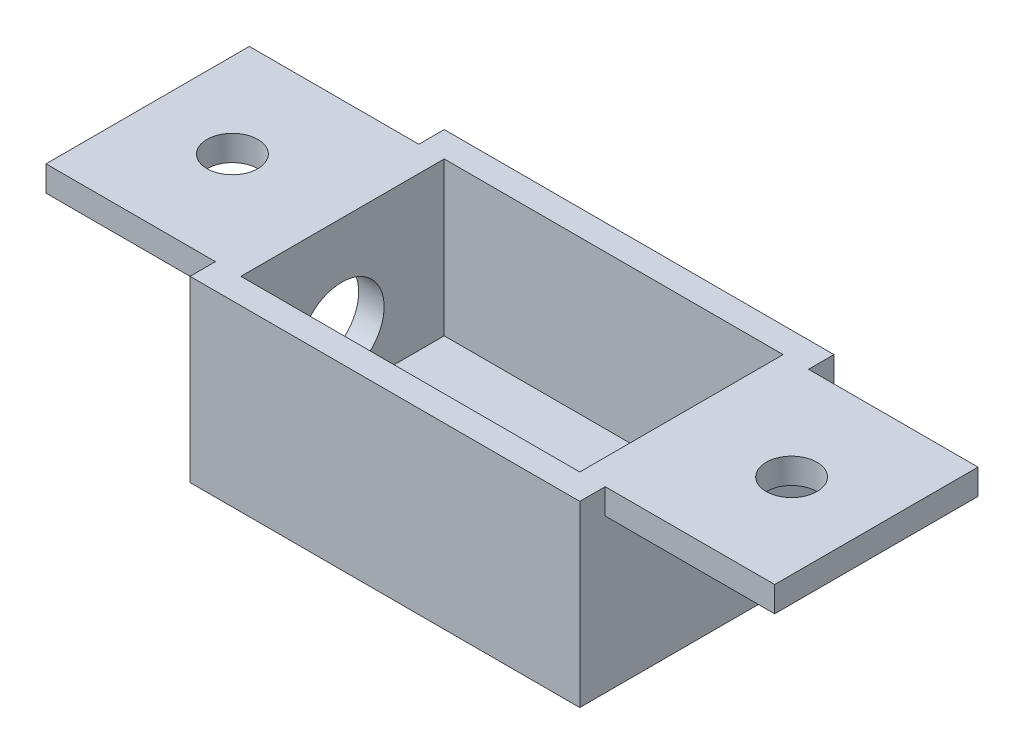
ISO-10303-21;
HEADER;
FILE_DESCRIPTION(('STEP AP214'),'2;1');
FILE_NAME('part.step','',(''),(''),'','','');
FILE_SCHEMA(('AUTOMOTIVE_DESIGN { 1 0 10303 214 1 1 1 1 }'));
ENDSEC;
DATA;
#1=APPLICATION_CONTEXT('core data for automotive mechanical design processes');
#2=APPLICATION_PROTOCOL_DEFINITION('international standard','automotive_design',2000,#1);
#3=PRODUCT_CONTEXT('',#1,'mechanical');
#4=PRODUCT('Part','Part','',(#3));
#5=PRODUCT_RELATED_PRODUCT_CATEGORY('part','',(#4));
#6=PRODUCT_DEFINITION_FORMATION('','',#4);
#7=PRODUCT_DEFINITION_CONTEXT('part definition',#1,'design');
#8=PRODUCT_DEFINITION('design','',#6,#7);
#9=PRODUCT_DEFINITION_SHAPE('','',#8);
#10=(LENGTH_UNIT() NAMED_UNIT(*) SI_UNIT(.MILLI.,.METRE.));
#11=(NAMED_UNIT(*) PLANE_ANGLE_UNIT() SI_UNIT($,.RADIAN.));
#12=(NAMED_UNIT(*) SI_UNIT($,.STERADIAN.) SOLID_ANGLE_UNIT());
#13=UNCERTAINTY_MEASURE_WITH_UNIT(LENGTH_MEASURE(1.E-05),#10,'distance_accuracy_value','');
#14=(GEOMETRIC_REPRESENTATION_CONTEXT(3) GLOBAL_UNCERTAINTY_ASSIGNED_CONTEXT((#13)) GLOBAL_UNIT_ASSIGNED_CONTEXT((#10,
#11,#12)) REPRESENTATION_CONTEXT('',''));
#15=CARTESIAN_POINT('',(0.,0.,0.));
#16=DIRECTION('',(0.,0.,1.));
#17=DIRECTION('',(1.,0.,0.));
#18=AXIS2_PLACEMENT_3D('',#15,#16,#17);
#19=CARTESIAN_POINT('',(0.,0.,0.));
#20=DIRECTION('',(0.,0.,1.));
#21=DIRECTION('',(1.,0.,0.));
#22=AXIS2_PLACEMENT_3D('',#19,#20,#21);
#23=PLANE('',#22);
#24=DIRECTION('',(0.,-1.,0.));
#25=VECTOR('',#24,1.);
#26=CARTESIAN_POINT('',(0.,7.81196010297524,0.));
#27=LINE('',#26,#25);
#28=CARTESIAN_POINT('',(0.,28.893533874708,0.));
#29=VERTEX_POINT('',#28);
#30=CARTESIAN_POINT('',(0.,25.893533874708,0.));
#31=VERTEX_POINT('',#30);
#32=EDGE_CURVE('E51',#29,#31,#27,.T.);
#33=ORIENTED_EDGE('',*,*,#32,.F.);
#34=DIRECTION('',(-1.,0.,0.));
#35=VECTOR('',#34,1.);
#36=CARTESIAN_POINT('',(-3.,28.893533874708,0.));
#37=LINE('',#36,#35);
#38=CARTESIAN_POINT('',(20.,28.893533874708,0.));
#39=VERTEX_POINT('',#38);
#40=EDGE_CURVE('E248',#39,#29,#37,.T.);
#41=ORIENTED_EDGE('',*,*,#40,.F.);
#42=DIRECTION('',(0.,1.,0.));
#43=VECTOR('',#42,1.);
#44=CARTESIAN_POINT('',(20.,25.893533874708,0.));
#45=LINE('',#44,#43);
#46=CARTESIAN_POINT('',(20.,25.893533874708,0.));
#47=VERTEX_POINT('',#46);
#48=EDGE_CURVE('E246',#47,#39,#45,.T.);
#49=ORIENTED_EDGE('',*,*,#48,.F.);
#50=DIRECTION('',(1.,0.,0.));
#51=VECTOR('',#50,1.);
#52=CARTESIAN_POINT('',(0.,25.893533874708,0.));
#53=LINE('',#52,#51);
#54=EDGE_CURVE('E244',#31,#47,#53,.T.);
#55=ORIENTED_EDGE('',*,*,#54,.F.);
#56=EDGE_LOOP('',(#33,#41,#49,#55));
#57=FACE_BOUND('',#56,.T.);
#58=ADVANCED_FACE('F34',(#57),#23,.F.);
#59=DIRECTION('',(0.,1.,0.));
#60=VECTOR('',#59,1.);
#61=CARTESIAN_POINT('',(-46.,7.81196010297524,0.));
#62=LINE('',#61,#60);
#63=CARTESIAN_POINT('',(-46.,25.893533874708,0.));
#64=VERTEX_POINT('',#63);
#65=CARTESIAN_POINT('',(-46.,28.893533874708,0.));
#66=VERTEX_POINT('',#65);
#67=EDGE_CURVE('E11',#64,#66,#62,.T.);
#68=ORIENTED_EDGE('',*,*,#67,.F.);
#69=DIRECTION('',(1.,0.,0.));
#70=VECTOR('',#69,1.);
#71=CARTESIAN_POINT('',(-66.,25.893533874708,0.));
#72=LINE('',#71,#70);
#73=CARTESIAN_POINT('',(-66.,25.893533874708,0.));
#74=VERTEX_POINT('',#73);
#75=EDGE_CURVE('E241',#74,#64,#72,.T.);
#76=ORIENTED_EDGE('',*,*,#75,.F.);
#77=DIRECTION('',(0.,-1.,0.));
#78=VECTOR('',#77,1.);
#79=CARTESIAN_POINT('',(-66.,28.893533874708,0.));
#80=LINE('',#79,#78);
#81=CARTESIAN_POINT('',(-66.,28.893533874708,0.));
#82=VERTEX_POINT('',#81);
#83=EDGE_CURVE('E214',#82,#74,#80,.T.);
#84=ORIENTED_EDGE('',*,*,#83,.F.);
#85=DIRECTION('',(-1.,0.,0.));
#86=VECTOR('',#85,1.);
#87=CARTESIAN_POINT('',(-66.,28.893533874708,0.));
#88=LINE('',#87,#86);
#89=EDGE_CURVE('E219',#66,#82,#88,.T.);
#90=ORIENTED_EDGE('',*,*,#89,.F.);
#91=EDGE_LOOP('',(#68,#76,#84,#90));
#92=FACE_BOUND('',#91,.T.);
#93=ADVANCED_FACE('F322',(#92),#23,.F.);
#94=CARTESIAN_POINT('',(0.,0.,24.));
#95=DIRECTION('',(0.,0.,1.));
#96=DIRECTION('',(1.,0.,0.));
#97=AXIS2_PLACEMENT_3D('',#94,#95,#96);
#98=PLANE('',#97);
#99=DIRECTION('',(0.,-1.,0.));
#100=VECTOR('',#99,1.);
#101=CARTESIAN_POINT('',(-46.,7.81196010297524,24.));
#102=LINE('',#101,#100);
#103=CARTESIAN_POINT('',(-46.,28.893533874708,24.));
#104=VERTEX_POINT('',#103);
#105=CARTESIAN_POINT('',(-46.,25.893533874708,24.));
#106=VERTEX_POINT('',#105);
#107=EDGE_CURVE('E59',#104,#106,#102,.T.);
#108=ORIENTED_EDGE('',*,*,#107,.F.);
#109=DIRECTION('',(-1.,0.,0.));
#110=VECTOR('',#109,1.);
#111=CARTESIAN_POINT('',(-66.,28.893533874708,24.));
#112=LINE('',#111,#110);
#113=CARTESIAN_POINT('',(-66.,28.893533874708,24.));
#114=VERTEX_POINT('',#113);
#115=EDGE_CURVE('E236',#104,#114,#112,.T.);
#116=ORIENTED_EDGE('',*,*,#115,.T.);
#117=DIRECTION('',(0.,-1.,0.));
#118=VECTOR('',#117,1.);
#119=CARTESIAN_POINT('',(-66.,28.893533874708,24.));
#120=LINE('',#119,#118);
#121=CARTESIAN_POINT('',(-66.,25.893533874708,24.));
#122=VERTEX_POINT('',#121);
#123=EDGE_CURVE('E215',#114,#122,#120,.T.);
#124=ORIENTED_EDGE('',*,*,#123,.T.);
#125=DIRECTION('',(1.,0.,0.));
#126=VECTOR('',#125,1.);
#127=CARTESIAN_POINT('',(-66.,25.893533874708,24.));
#128=LINE('',#127,#126);
#129=EDGE_CURVE('E218',#122,#106,#128,.T.);
#130=ORIENTED_EDGE('',*,*,#129,.T.);
#131=EDGE_LOOP('',(#108,#116,#124,#130));
#132=FACE_BOUND('',#131,.T.);
#133=ADVANCED_FACE('F320',(#132),#98,.T.);
#134=CARTESIAN_POINT('',(-66.,28.893533874708,24.));
#135=DIRECTION('',(1.,0.,0.));
#136=DIRECTION('',(0.,0.,-1.));
#137=AXIS2_PLACEMENT_3D('',#134,#135,#136);
#138=PLANE('',#137);
#139=ORIENTED_EDGE('',*,*,#83,.T.);
#140=DIRECTION('',(0.,0.,-1.));
#141=VECTOR('',#140,1.);
#142=CARTESIAN_POINT('',(-66.,25.893533874708,24.));
#143=LINE('',#142,#141);
#144=EDGE_CURVE('E206',#122,#74,#143,.T.);
#145=ORIENTED_EDGE('',*,*,#144,.F.);
#146=ORIENTED_EDGE('',*,*,#123,.F.);
#147=DIRECTION('',(0.,0.,-1.));
#148=VECTOR('',#147,1.);
#149=CARTESIAN_POINT('',(-66.,28.893533874708,24.));
#150=LINE('',#149,#148);
#151=EDGE_CURVE('E238',#114,#82,#150,.T.);
#152=ORIENTED_EDGE('',*,*,#151,.T.);
#153=EDGE_LOOP('',(#139,#145,#146,#152));
#154=FACE_BOUND('',#153,.T.);
#155=ADVANCED_FACE('F36',(#154),#138,.F.);
#156=CARTESIAN_POINT('',(-66.,25.893533874708,24.));
#157=DIRECTION('',(0.,1.,0.));
#158=DIRECTION('',(0.,0.,1.));
#159=AXIS2_PLACEMENT_3D('',#156,#157,#158);
#160=PLANE('',#159);
#161=CARTESIAN_POINT('',(-56.,25.893533874708,12.));
#162=DIRECTION('',(0.,-1.,0.));
#163=DIRECTION('',(1.,0.,0.));
#164=AXIS2_PLACEMENT_3D('',#161,#162,#163);
#165=CIRCLE('',#164,3.);
#166=CARTESIAN_POINT('',(-53.,25.893533874708,12.));
#167=VERTEX_POINT('',#166);
#168=EDGE_CURVE('E294',#167,#167,#165,.T.);
#169=ORIENTED_EDGE('',*,*,#168,.F.);
#170=EDGE_LOOP('',(#169));
#171=FACE_BOUND('',#170,.T.);
#172=ORIENTED_EDGE('',*,*,#75,.T.);
#173=DIRECTION('',(0.,0.,-1.));
#174=VECTOR('',#173,1.);
#175=CARTESIAN_POINT('',(-46.,25.893533874708,24.));
#176=LINE('',#175,#174);
#177=EDGE_CURVE('E278',#106,#64,#176,.T.);
#178=ORIENTED_EDGE('',*,*,#177,.F.);
#179=ORIENTED_EDGE('',*,*,#129,.F.);
#180=ORIENTED_EDGE('',*,*,#144,.T.);
#181=EDGE_LOOP('',(#172,#178,#179,#180));
#182=FACE_BOUND('',#181,.T.);
#183=ADVANCED_FACE('F302',(#171,#182),#160,.F.);
#184=CARTESIAN_POINT('',(-46.,25.893533874708,24.));
#185=DIRECTION('',(1.,0.,0.));
#186=DIRECTION('',(0.,0.,-1.));
#187=AXIS2_PLACEMENT_3D('',#184,#185,#186);
#188=PLANE('',#187);
#189=CARTESIAN_POINT('',(-46.,17.3392063612262,12.0935575963953));
#190=DIRECTION('',(-1.,0.,0.));
#191=DIRECTION('',(0.,0.,1.));
#192=AXIS2_PLACEMENT_3D('',#189,#190,#191);
#193=CIRCLE('',#192,5.);
#194=CARTESIAN_POINT('',(-46.,17.3392063612262,17.0935575963953));
#195=VERTEX_POINT('',#194);
#196=EDGE_CURVE('E181',#195,#195,#193,.T.);
#197=ORIENTED_EDGE('',*,*,#196,.F.);
#198=EDGE_LOOP('',(#197));
#199=FACE_BOUND('',#198,.T.);
#200=ORIENTED_EDGE('',*,*,#177,.T.);
#201=ORIENTED_EDGE('',*,*,#67,.T.);
#202=DIRECTION('',(0.,0.,1.));
#203=VECTOR('',#202,1.);
#204=CARTESIAN_POINT('',(-46.,28.893533874708,-3.));
#205=LINE('',#204,#203);
#206=CARTESIAN_POINT('',(-46.,28.893533874708,-3.));
#207=VERTEX_POINT('',#206);
#208=EDGE_CURVE('E190',#207,#66,#205,.T.);
#209=ORIENTED_EDGE('',*,*,#208,.F.);
#210=DIRECTION('',(0.,1.,0.));
#211=VECTOR('',#210,1.);
#212=CARTESIAN_POINT('',(-46.,7.81196010297524,-3.));
#213=LINE('',#212,#211);
#214=CARTESIAN_POINT('',(-46.,7.81196010297524,-3.));
#215=VERTEX_POINT('',#214);
#216=EDGE_CURVE('E170',#215,#207,#213,.T.);
#217=ORIENTED_EDGE('',*,*,#216,.F.);
#218=DIRECTION('',(0.,0.,-1.));
#219=VECTOR('',#218,1.);
#220=CARTESIAN_POINT('',(-46.,7.81196010297524,24.));
#221=LINE('',#220,#219);
#222=CARTESIAN_POINT('',(-46.,7.81196010297524,27.));
#223=VERTEX_POINT('',#222);
#224=EDGE_CURVE('E162',#223,#215,#221,.T.);
#225=ORIENTED_EDGE('',*,*,#224,.F.);
#226=DIRECTION('',(0.,-1.,0.));
#227=VECTOR('',#226,1.);
#228=CARTESIAN_POINT('',(-46.,7.81196010297524,27.));
#229=LINE('',#228,#227);
#230=CARTESIAN_POINT('',(-46.,28.893533874708,27.));
#231=VERTEX_POINT('',#230);
#232=EDGE_CURVE('E193',#231,#223,#229,.T.);
#233=ORIENTED_EDGE('',*,*,#232,.F.);
#234=DIRECTION('',(0.,0.,-1.));
#235=VECTOR('',#234,1.);
#236=CARTESIAN_POINT('',(-46.,28.893533874708,27.));
#237=LINE('',#236,#235);
#238=EDGE_CURVE('E202',#231,#104,#237,.T.);
#239=ORIENTED_EDGE('',*,*,#238,.T.);
#240=ORIENTED_EDGE('',*,*,#107,.T.);
#241=EDGE_LOOP('',(#200,#201,#209,#217,#225,#233,#239,#240));
#242=FACE_BOUND('',#241,.T.);
#243=ADVANCED_FACE('F305',(#199,#242),#188,.F.);
#244=CARTESIAN_POINT('',(-46.,7.81196010297524,24.));
#245=DIRECTION('',(0.,1.,0.));
#246=DIRECTION('',(-1.,0.,0.));
#247=AXIS2_PLACEMENT_3D('',#244,#245,#246);
#248=PLANE('',#247);
#249=ORIENTED_EDGE('',*,*,#224,.T.);
#250=DIRECTION('',(-1.,0.,0.));
#251=VECTOR('',#250,1.);
#252=CARTESIAN_POINT('',(0.,7.81196010297524,-3.));
#253=LINE('',#252,#251);
#254=CARTESIAN_POINT('',(0.,7.81196010297524,-3.));
#255=VERTEX_POINT('',#254);
#256=EDGE_CURVE('E166',#255,#215,#253,.T.);
#257=ORIENTED_EDGE('',*,*,#256,.F.);
#258=DIRECTION('',(0.,0.,-1.));
#259=VECTOR('',#258,1.);
#260=CARTESIAN_POINT('',(0.,7.81196010297524,24.));
#261=LINE('',#260,#259);
#262=CARTESIAN_POINT('',(0.,7.81196010297524,27.));
#263=VERTEX_POINT('',#262);
#264=EDGE_CURVE('E151',#263,#255,#261,.T.);
#265=ORIENTED_EDGE('',*,*,#264,.F.);
#266=DIRECTION('',(1.,0.,0.));
#267=VECTOR('',#266,1.);
#268=CARTESIAN_POINT('',(-46.,7.81196010297524,27.));
#269=LINE('',#268,#267);
#270=EDGE_CURVE('E196',#223,#263,#269,.T.);
#271=ORIENTED_EDGE('',*,*,#270,.F.);
#272=EDGE_LOOP('',(#249,#257,#265,#271));
#273=FACE_BOUND('',#272,.T.);
#274=ADVANCED_FACE('F167',(#273),#248,.F.);
#275=CARTESIAN_POINT('',(0.,7.81196010297524,24.));
#276=DIRECTION('',(-1.,0.,0.));
#277=DIRECTION('',(0.,0.,1.));
#278=AXIS2_PLACEMENT_3D('',#275,#276,#277);
#279=PLANE('',#278);
#280=ORIENTED_EDGE('',*,*,#264,.T.);
#281=DIRECTION('',(0.,-1.,0.));
#282=VECTOR('',#281,1.);
#283=CARTESIAN_POINT('',(0.,7.81196010297524,-3.));
#284=LINE('',#283,#282);
#285=CARTESIAN_POINT('',(0.,28.893533874708,-3.));
#286=VERTEX_POINT('',#285);
#287=EDGE_CURVE('E156',#286,#255,#284,.T.);
#288=ORIENTED_EDGE('',*,*,#287,.F.);
#289=DIRECTION('',(0.,0.,1.));
#290=VECTOR('',#289,1.);
#291=CARTESIAN_POINT('',(0.,28.893533874708,-3.));
#292=LINE('',#291,#290);
#293=EDGE_CURVE('E186',#286,#29,#292,.T.);
#294=ORIENTED_EDGE('',*,*,#293,.T.);
#295=ORIENTED_EDGE('',*,*,#32,.T.);
#296=DIRECTION('',(0.,0.,-1.));
#297=VECTOR('',#296,1.);
#298=CARTESIAN_POINT('',(0.,25.893533874708,24.));
#299=LINE('',#298,#297);
#300=CARTESIAN_POINT('',(0.,25.893533874708,24.));
#301=VERTEX_POINT('',#300);
#302=EDGE_CURVE('E163',#301,#31,#299,.T.);
#303=ORIENTED_EDGE('',*,*,#302,.F.);
#304=DIRECTION('',(0.,1.,0.));
#305=VECTOR('',#304,1.);
#306=CARTESIAN_POINT('',(0.,7.81196010297524,24.));
#307=LINE('',#306,#305);
#308=CARTESIAN_POINT('',(0.,28.893533874708,24.));
#309=VERTEX_POINT('',#308);
#310=EDGE_CURVE('E43',#301,#309,#307,.T.);
#311=ORIENTED_EDGE('',*,*,#310,.T.);
#312=DIRECTION('',(0.,0.,-1.));
#313=VECTOR('',#312,1.);
#314=CARTESIAN_POINT('',(0.,28.893533874708,27.));
#315=LINE('',#314,#313);
#316=CARTESIAN_POINT('',(0.,28.893533874708,27.));
#317=VERTEX_POINT('',#316);
#318=EDGE_CURVE('E211',#317,#309,#315,.T.);
#319=ORIENTED_EDGE('',*,*,#318,.F.);
#320=DIRECTION('',(0.,1.,0.));
#321=VECTOR('',#320,1.);
#322=CARTESIAN_POINT('',(0.,7.81196010297524,27.));
#323=LINE('',#322,#321);
#324=EDGE_CURVE('E158',#263,#317,#323,.T.);
#325=ORIENTED_EDGE('',*,*,#324,.F.);
#326=EDGE_LOOP('',(#280,#288,#294,#295,#303,#311,#319,#325));
#327=FACE_BOUND('',#326,.T.);
#328=ADVANCED_FACE('F153',(#327),#279,.F.);
#329=CARTESIAN_POINT('',(0.,25.893533874708,24.));
#330=DIRECTION('',(0.,1.,0.));
#331=DIRECTION('',(-1.,0.,0.));
#332=AXIS2_PLACEMENT_3D('',#329,#330,#331);
#333=PLANE('',#332);
#334=CARTESIAN_POINT('',(10.,25.893533874708,12.));
#335=DIRECTION('',(0.,-1.,0.));
#336=DIRECTION('',(1.,0.,0.));
#337=AXIS2_PLACEMENT_3D('',#334,#335,#336);
#338=CIRCLE('',#337,3.);
#339=CARTESIAN_POINT('',(13.,25.893533874708,12.));
#340=VERTEX_POINT('',#339);
#341=EDGE_CURVE('E286',#340,#340,#338,.T.);
#342=ORIENTED_EDGE('',*,*,#341,.F.);
#343=EDGE_LOOP('',(#342));
#344=FACE_BOUND('',#343,.T.);
#345=ORIENTED_EDGE('',*,*,#54,.T.);
#346=DIRECTION('',(0.,0.,-1.));
#347=VECTOR('',#346,1.);
#348=CARTESIAN_POINT('',(20.,25.893533874708,24.));
#349=LINE('',#348,#347);
#350=CARTESIAN_POINT('',(20.,25.893533874708,24.));
#351=VERTEX_POINT('',#350);
#352=EDGE_CURVE('E273',#351,#47,#349,.T.);
#353=ORIENTED_EDGE('',*,*,#352,.F.);
#354=DIRECTION('',(1.,0.,0.));
#355=VECTOR('',#354,1.);
#356=CARTESIAN_POINT('',(0.,25.893533874708,24.));
#357=LINE('',#356,#355);
#358=EDGE_CURVE('E221',#301,#351,#357,.T.);
#359=ORIENTED_EDGE('',*,*,#358,.F.);
#360=ORIENTED_EDGE('',*,*,#302,.T.);
#361=EDGE_LOOP('',(#345,#353,#359,#360));
#362=FACE_BOUND('',#361,.T.);
#363=ADVANCED_FACE('F337',(#344,#362),#333,.F.);
#364=CARTESIAN_POINT('',(20.,25.893533874708,24.));
#365=DIRECTION('',(-1.,0.,0.));
#366=DIRECTION('',(0.,0.,1.));
#367=AXIS2_PLACEMENT_3D('',#364,#365,#366);
#368=PLANE('',#367);
#369=ORIENTED_EDGE('',*,*,#48,.T.);
#370=DIRECTION('',(0.,0.,-1.));
#371=VECTOR('',#370,1.);
#372=CARTESIAN_POINT('',(20.,28.893533874708,24.));
#373=LINE('',#372,#371);
#374=CARTESIAN_POINT('',(20.,28.893533874708,24.));
#375=VERTEX_POINT('',#374);
#376=EDGE_CURVE('E270',#375,#39,#373,.T.);
#377=ORIENTED_EDGE('',*,*,#376,.F.);
#378=DIRECTION('',(0.,1.,0.));
#379=VECTOR('',#378,1.);
#380=CARTESIAN_POINT('',(20.,25.893533874708,24.));
#381=LINE('',#380,#379);
#382=EDGE_CURVE('E223',#351,#375,#381,.T.);
#383=ORIENTED_EDGE('',*,*,#382,.F.);
#384=ORIENTED_EDGE('',*,*,#352,.T.);
#385=EDGE_LOOP('',(#369,#377,#383,#384));
#386=FACE_BOUND('',#385,.T.);
#387=ADVANCED_FACE('F334',(#386),#368,.F.);
#388=CARTESIAN_POINT('',(-3.,10.8119601029752,24.));
#389=DIRECTION('',(1.,0.,0.));
#390=DIRECTION('',(0.,1.,0.));
#391=AXIS2_PLACEMENT_3D('',#388,#389,#390);
#392=PLANE('',#391);
#393=DIRECTION('',(0.,-1.,0.));
#394=VECTOR('',#393,1.);
#395=CARTESIAN_POINT('',(-3.,10.8119601029752,0.));
#396=LINE('',#395,#394);
#397=CARTESIAN_POINT('',(-3.,28.893533874708,0.));
#398=VERTEX_POINT('',#397);
#399=CARTESIAN_POINT('',(-3.,10.8119601029752,0.));
#400=VERTEX_POINT('',#399);
#401=EDGE_CURVE('E250',#398,#400,#396,.T.);
#402=ORIENTED_EDGE('',*,*,#401,.T.);
#403=DIRECTION('',(0.,0.,-1.));
#404=VECTOR('',#403,1.);
#405=CARTESIAN_POINT('',(-3.,10.8119601029752,24.));
#406=LINE('',#405,#404);
#407=CARTESIAN_POINT('',(-3.,10.8119601029752,24.));
#408=VERTEX_POINT('',#407);
#409=EDGE_CURVE('E265',#408,#400,#406,.T.);
#410=ORIENTED_EDGE('',*,*,#409,.F.);
#411=DIRECTION('',(0.,-1.,0.));
#412=VECTOR('',#411,1.);
#413=CARTESIAN_POINT('',(-3.,10.8119601029752,24.));
#414=LINE('',#413,#412);
#415=CARTESIAN_POINT('',(-3.,28.893533874708,24.));
#416=VERTEX_POINT('',#415);
#417=EDGE_CURVE('E227',#416,#408,#414,.T.);
#418=ORIENTED_EDGE('',*,*,#417,.F.);
#419=DIRECTION('',(0.,0.,-1.));
#420=VECTOR('',#419,1.);
#421=CARTESIAN_POINT('',(-3.,28.893533874708,24.));
#422=LINE('',#421,#420);
#423=EDGE_CURVE('E268',#416,#398,#422,.T.);
#424=ORIENTED_EDGE('',*,*,#423,.T.);
#425=EDGE_LOOP('',(#402,#410,#418,#424));
#426=FACE_BOUND('',#425,.T.);
#427=ADVANCED_FACE('F345',(#426),#392,.F.);
#428=CARTESIAN_POINT('',(-43.,10.8119601029752,24.));
#429=DIRECTION('',(0.,-1.,0.));
#430=DIRECTION('',(0.,0.,-1.));
#431=AXIS2_PLACEMENT_3D('',#428,#429,#430);
#432=PLANE('',#431);
#433=DIRECTION('',(-1.,0.,0.));
#434=VECTOR('',#433,1.);
#435=CARTESIAN_POINT('',(-43.,10.8119601029752,0.));
#436=LINE('',#435,#434);
#437=CARTESIAN_POINT('',(-43.,10.8119601029752,0.));
#438=VERTEX_POINT('',#437);
#439=EDGE_CURVE('E252',#400,#438,#436,.T.);
#440=ORIENTED_EDGE('',*,*,#439,.T.);
#441=DIRECTION('',(0.,0.,-1.));
#442=VECTOR('',#441,1.);
#443=CARTESIAN_POINT('',(-43.,10.8119601029752,24.));
#444=LINE('',#443,#442);
#445=CARTESIAN_POINT('',(-43.,10.8119601029752,24.));
#446=VERTEX_POINT('',#445);
#447=EDGE_CURVE('E262',#446,#438,#444,.T.);
#448=ORIENTED_EDGE('',*,*,#447,.F.);
#449=DIRECTION('',(-1.,0.,0.));
#450=VECTOR('',#449,1.);
#451=CARTESIAN_POINT('',(-43.,10.8119601029752,24.));
#452=LINE('',#451,#450);
#453=EDGE_CURVE('E230',#408,#446,#452,.T.);
#454=ORIENTED_EDGE('',*,*,#453,.F.);
#455=ORIENTED_EDGE('',*,*,#409,.T.);
#456=EDGE_LOOP('',(#440,#448,#454,#455));
#457=FACE_BOUND('',#456,.T.);
#458=ADVANCED_FACE('F362',(#457),#432,.F.);
#459=CARTESIAN_POINT('',(-43.,28.893533874708,24.));
#460=DIRECTION('',(-1.,0.,0.));
#461=DIRECTION('',(0.,0.,1.));
#462=AXIS2_PLACEMENT_3D('',#459,#460,#461);
#463=PLANE('',#462);
#464=CARTESIAN_POINT('',(-43.,17.3392063612262,12.0935575963953));
#465=DIRECTION('',(-1.,0.,0.));
#466=DIRECTION('',(0.,0.,1.));
#467=AXIS2_PLACEMENT_3D('',#464,#465,#466);
#468=CIRCLE('',#467,5.);
#469=CARTESIAN_POINT('',(-43.,17.3392063612262,17.0935575963953));
#470=VERTEX_POINT('',#469);
#471=EDGE_CURVE('E187',#470,#470,#468,.T.);
#472=ORIENTED_EDGE('',*,*,#471,.T.);
#473=EDGE_LOOP('',(#472));
#474=FACE_BOUND('',#473,.T.);
#475=DIRECTION('',(0.,1.,0.));
#476=VECTOR('',#475,1.);
#477=CARTESIAN_POINT('',(-43.,28.893533874708,0.));
#478=LINE('',#477,#476);
#479=CARTESIAN_POINT('',(-43.,28.893533874708,0.));
#480=VERTEX_POINT('',#479);
#481=EDGE_CURVE('E254',#438,#480,#478,.T.);
#482=ORIENTED_EDGE('',*,*,#481,.T.);
#483=DIRECTION('',(0.,0.,-1.));
#484=VECTOR('',#483,1.);
#485=CARTESIAN_POINT('',(-43.,28.893533874708,24.));
#486=LINE('',#485,#484);
#487=CARTESIAN_POINT('',(-43.,28.893533874708,24.));
#488=VERTEX_POINT('',#487);
#489=EDGE_CURVE('E259',#488,#480,#486,.T.);
#490=ORIENTED_EDGE('',*,*,#489,.F.);
#491=DIRECTION('',(0.,1.,0.));
#492=VECTOR('',#491,1.);
#493=CARTESIAN_POINT('',(-43.,28.893533874708,24.));
#494=LINE('',#493,#492);
#495=EDGE_CURVE('E233',#446,#488,#494,.T.);
#496=ORIENTED_EDGE('',*,*,#495,.F.);
#497=ORIENTED_EDGE('',*,*,#447,.T.);
#498=EDGE_LOOP('',(#482,#490,#496,#497));
#499=FACE_BOUND('',#498,.T.);
#500=ADVANCED_FACE('F358',(#474,#499),#463,.F.);
#501=CARTESIAN_POINT('',(-66.,28.893533874708,24.));
#502=DIRECTION('',(0.,-1.,0.));
#503=DIRECTION('',(0.,0.,-1.));
#504=AXIS2_PLACEMENT_3D('',#501,#502,#503);
#505=PLANE('',#504);
#506=CARTESIAN_POINT('',(-56.,28.893533874708,12.));
#507=DIRECTION('',(0.,-1.,0.));
#508=DIRECTION('',(0.,0.,-1.));
#509=AXIS2_PLACEMENT_3D('',#506,#507,#508);
#510=CIRCLE('',#509,3.);
#511=CARTESIAN_POINT('',(-56.,28.893533874708,9.));
#512=VERTEX_POINT('',#511);
#513=EDGE_CURVE('E38',#512,#512,#510,.T.);
#514=ORIENTED_EDGE('',*,*,#513,.T.);
#515=EDGE_LOOP('',(#514));
#516=FACE_BOUND('',#515,.T.);
#517=CARTESIAN_POINT('',(10.,28.893533874708,12.));
#518=DIRECTION('',(0.,-1.,0.));
#519=DIRECTION('',(0.,0.,-1.));
#520=AXIS2_PLACEMENT_3D('',#517,#518,#519);
#521=CIRCLE('',#520,3.);
#522=CARTESIAN_POINT('',(10.,28.893533874708,9.));
#523=VERTEX_POINT('',#522);
#524=EDGE_CURVE('E284',#523,#523,#521,.T.);
#525=ORIENTED_EDGE('',*,*,#524,.T.);
#526=EDGE_LOOP('',(#525));
#527=FACE_BOUND('',#526,.T.);
#528=ORIENTED_EDGE('',*,*,#208,.T.);
#529=ORIENTED_EDGE('',*,*,#89,.T.);
#530=ORIENTED_EDGE('',*,*,#151,.F.);
#531=ORIENTED_EDGE('',*,*,#115,.F.);
#532=ORIENTED_EDGE('',*,*,#238,.F.);
#533=DIRECTION('',(-1.,0.,0.));
#534=VECTOR('',#533,1.);
#535=CARTESIAN_POINT('',(-46.,28.893533874708,27.));
#536=LINE('',#535,#534);
#537=EDGE_CURVE('E200',#317,#231,#536,.T.);
#538=ORIENTED_EDGE('',*,*,#537,.F.);
#539=ORIENTED_EDGE('',*,*,#318,.T.);
#540=DIRECTION('',(-1.,0.,0.));
#541=VECTOR('',#540,1.);
#542=CARTESIAN_POINT('',(-3.,28.893533874708,24.));
#543=LINE('',#542,#541);
#544=EDGE_CURVE('E225',#375,#309,#543,.T.);
#545=ORIENTED_EDGE('',*,*,#544,.F.);
#546=ORIENTED_EDGE('',*,*,#376,.T.);
#547=ORIENTED_EDGE('',*,*,#40,.T.);
#548=ORIENTED_EDGE('',*,*,#293,.F.);
#549=DIRECTION('',(1.,0.,0.));
#550=VECTOR('',#549,1.);
#551=CARTESIAN_POINT('',(0.,28.893533874708,-3.));
#552=LINE('',#551,#550);
#553=EDGE_CURVE('E174',#207,#286,#552,.T.);
#554=ORIENTED_EDGE('',*,*,#553,.F.);
#555=EDGE_LOOP('',(#528,#529,#530,#531,#532,#538,#539,#545,#546,#547,#548,#554));
#556=FACE_BOUND('',#555,.T.);
#557=ORIENTED_EDGE('',*,*,#489,.T.);
#558=DIRECTION('',(1.,0.,0.));
#559=VECTOR('',#558,1.);
#560=CARTESIAN_POINT('',(0.,28.893533874708,0.));
#561=LINE('',#560,#559);
#562=EDGE_CURVE('E176',#480,#398,#561,.T.);
#563=ORIENTED_EDGE('',*,*,#562,.T.);
#564=ORIENTED_EDGE('',*,*,#423,.F.);
#565=DIRECTION('',(-1.,0.,0.));
#566=VECTOR('',#565,1.);
#567=CARTESIAN_POINT('',(-46.,28.893533874708,24.));
#568=LINE('',#567,#566);
#569=EDGE_CURVE('E197',#416,#488,#568,.T.);
#570=ORIENTED_EDGE('',*,*,#569,.T.);
#571=EDGE_LOOP('',(#557,#563,#564,#570));
#572=FACE_BOUND('',#571,.T.);
#573=ADVANCED_FACE('F316',(#516,#527,#556,#572),#505,.F.);
#574=ORIENTED_EDGE('',*,*,#310,.F.);
#575=ORIENTED_EDGE('',*,*,#358,.T.);
#576=ORIENTED_EDGE('',*,*,#382,.T.);
#577=ORIENTED_EDGE('',*,*,#544,.T.);
#578=EDGE_LOOP('',(#574,#575,#576,#577));
#579=FACE_BOUND('',#578,.T.);
#580=ADVANCED_FACE('F329',(#579),#98,.T.);
#581=CARTESIAN_POINT('',(0.,0.,27.));
#582=DIRECTION('',(0.,0.,-1.));
#583=DIRECTION('',(-1.,0.,0.));
#584=AXIS2_PLACEMENT_3D('',#581,#582,#583);
#585=PLANE('',#584);
#586=ORIENTED_EDGE('',*,*,#232,.T.);
#587=ORIENTED_EDGE('',*,*,#270,.T.);
#588=ORIENTED_EDGE('',*,*,#324,.T.);
#589=ORIENTED_EDGE('',*,*,#537,.T.);
#590=EDGE_LOOP('',(#586,#587,#588,#589));
#591=FACE_BOUND('',#590,.T.);
#592=ADVANCED_FACE('F324',(#591),#585,.F.);
#593=CARTESIAN_POINT('',(0.,0.,24.));
#594=DIRECTION('',(0.,0.,-1.));
#595=DIRECTION('',(-1.,0.,0.));
#596=AXIS2_PLACEMENT_3D('',#593,#594,#595);
#597=PLANE('',#596);
#598=ORIENTED_EDGE('',*,*,#569,.F.);
#599=ORIENTED_EDGE('',*,*,#417,.T.);
#600=ORIENTED_EDGE('',*,*,#453,.T.);
#601=ORIENTED_EDGE('',*,*,#495,.T.);
#602=EDGE_LOOP('',(#598,#599,#600,#601));
#603=FACE_BOUND('',#602,.T.);
#604=ADVANCED_FACE('F383',(#603),#597,.T.);
#605=CARTESIAN_POINT('',(0.,0.,0.));
#606=DIRECTION('',(0.,0.,1.));
#607=DIRECTION('',(1.,0.,0.));
#608=AXIS2_PLACEMENT_3D('',#605,#606,#607);
#609=PLANE('',#608);
#610=ORIENTED_EDGE('',*,*,#481,.F.);
#611=ORIENTED_EDGE('',*,*,#439,.F.);
#612=ORIENTED_EDGE('',*,*,#401,.F.);
#613=ORIENTED_EDGE('',*,*,#562,.F.);
#614=EDGE_LOOP('',(#610,#611,#612,#613));
#615=FACE_BOUND('',#614,.T.);
#616=ADVANCED_FACE('F378',(#615),#609,.T.);
#617=CARTESIAN_POINT('',(0.,0.,-3.));
#618=DIRECTION('',(0.,0.,1.));
#619=DIRECTION('',(1.,0.,0.));
#620=AXIS2_PLACEMENT_3D('',#617,#618,#619);
#621=PLANE('',#620);
#622=ORIENTED_EDGE('',*,*,#287,.T.);
#623=ORIENTED_EDGE('',*,*,#256,.T.);
#624=ORIENTED_EDGE('',*,*,#216,.T.);
#625=ORIENTED_EDGE('',*,*,#553,.T.);
#626=EDGE_LOOP('',(#622,#623,#624,#625));
#627=FACE_BOUND('',#626,.T.);
#628=ADVANCED_FACE('F172',(#627),#621,.F.);
#629=CARTESIAN_POINT('',(-36.,17.3392063612262,12.0935575963953));
#630=DIRECTION('',(-1.,0.,0.));
#631=DIRECTION('',(0.,0.,1.));
#632=AXIS2_PLACEMENT_3D('',#629,#630,#631);
#633=CYLINDRICAL_SURFACE('',#632,5.);
#634=ORIENTED_EDGE('',*,*,#196,.T.);
#635=EDGE_LOOP('',(#634));
#636=FACE_BOUND('',#635,.T.);
#637=ORIENTED_EDGE('',*,*,#471,.F.);
#638=EDGE_LOOP('',(#637));
#639=FACE_BOUND('',#638,.T.);
#640=ADVANCED_FACE('F394',(#636,#639),#633,.F.);
#641=CARTESIAN_POINT('',(9.99999999999999,35.893533874708,12.));
#642=DIRECTION('',(0.,-1.,0.));
#643=DIRECTION('',(1.,0.,0.));
#644=AXIS2_PLACEMENT_3D('',#641,#642,#643);
#645=CYLINDRICAL_SURFACE('',#644,3.);
#646=ORIENTED_EDGE('',*,*,#341,.T.);
#647=EDGE_LOOP('',(#646));
#648=FACE_BOUND('',#647,.T.);
#649=ORIENTED_EDGE('',*,*,#524,.F.);
#650=EDGE_LOOP('',(#649));
#651=FACE_BOUND('',#650,.T.);
#652=ADVANCED_FACE('F397',(#648,#651),#645,.F.);
#653=CARTESIAN_POINT('',(-56.,35.893533874708,12.));
#654=DIRECTION('',(0.,-1.,0.));
#655=DIRECTION('',(1.,0.,0.));
#656=AXIS2_PLACEMENT_3D('',#653,#654,#655);
#657=CYLINDRICAL_SURFACE('',#656,3.);
#658=ORIENTED_EDGE('',*,*,#168,.T.);
#659=EDGE_LOOP('',(#658));
#660=FACE_BOUND('',#659,.T.);
#661=ORIENTED_EDGE('',*,*,#513,.F.);
#662=EDGE_LOOP('',(#661));
#663=FACE_BOUND('',#662,.T.);
#664=ADVANCED_FACE('F299',(#660,#663),#657,.F.);
#665=CLOSED_SHELL('',(#58,#93,#133,#155,#183,#243,#274,#328,#363,#387,#427,#458,#500,#573,#580,
#592,#604,#616,#628,#640,#652,#664));
#666=MANIFOLD_SOLID_BREP('B2',#665);
#667=ADVANCED_BREP_SHAPE_REPRESENTATION('',(#18,#666),#14);
#668=SHAPE_DEFINITION_REPRESENTATION(#9,#667);
ENDSEC;
END-ISO-10303-21;
